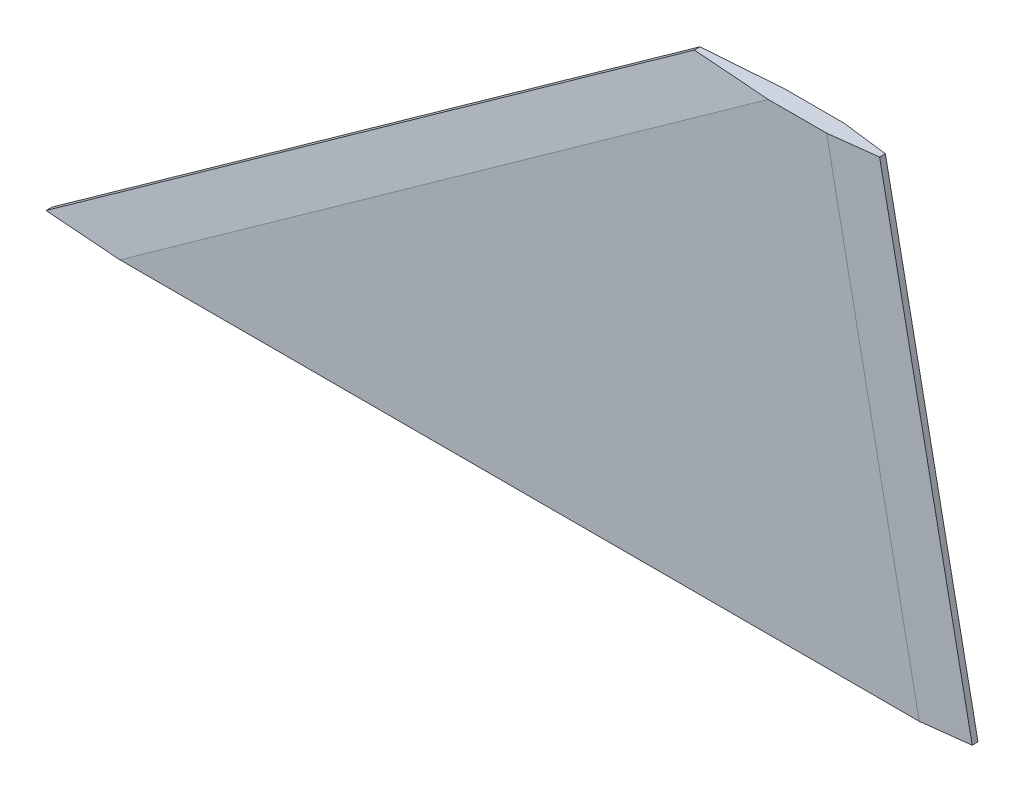
ISO-10303-21;
HEADER;
FILE_DESCRIPTION(('STEP AP214'),'2;1');
FILE_NAME('part.step','',(''),(''),'','','');
FILE_SCHEMA(('AUTOMOTIVE_DESIGN { 1 0 10303 214 1 1 1 1 }'));
ENDSEC;
DATA;
#1=APPLICATION_CONTEXT('core data for automotive mechanical design processes');
#2=APPLICATION_PROTOCOL_DEFINITION('international standard','automotive_design',2000,#1);
#3=PRODUCT_CONTEXT('',#1,'mechanical');
#4=PRODUCT('Part','Part','',(#3));
#5=PRODUCT_RELATED_PRODUCT_CATEGORY('part','',(#4));
#6=PRODUCT_DEFINITION_FORMATION('','',#4);
#7=PRODUCT_DEFINITION_CONTEXT('part definition',#1,'design');
#8=PRODUCT_DEFINITION('design','',#6,#7);
#9=PRODUCT_DEFINITION_SHAPE('','',#8);
#10=(LENGTH_UNIT() NAMED_UNIT(*) SI_UNIT(.MILLI.,.METRE.));
#11=(NAMED_UNIT(*) PLANE_ANGLE_UNIT() SI_UNIT($,.RADIAN.));
#12=(NAMED_UNIT(*) SI_UNIT($,.STERADIAN.) SOLID_ANGLE_UNIT());
#13=UNCERTAINTY_MEASURE_WITH_UNIT(LENGTH_MEASURE(1.E-05),#10,'distance_accuracy_value','');
#14=(GEOMETRIC_REPRESENTATION_CONTEXT(3) GLOBAL_UNCERTAINTY_ASSIGNED_CONTEXT((#13)) GLOBAL_UNIT_ASSIGNED_CONTEXT((#10,
#11,#12)) REPRESENTATION_CONTEXT('',''));
#15=CARTESIAN_POINT('',(0.,0.,0.));
#16=DIRECTION('',(0.,0.,1.));
#17=DIRECTION('',(1.,0.,0.));
#18=AXIS2_PLACEMENT_3D('',#15,#16,#17);
#19=CARTESIAN_POINT('',(177.8,127.,4.7625));
#20=DIRECTION('',(0.581238193719096,-0.813733471206735,0.));
#21=DIRECTION('',(0.813733471206735,0.581238193719096,0.));
#22=AXIS2_PLACEMENT_3D('',#19,#20,#21);
#23=PLANE('',#22);
#24=DIRECTION('',(0.,0.,-1.));
#25=VECTOR('',#24,1.);
#26=CARTESIAN_POINT('',(177.8,127.,4.7625));
#27=LINE('',#26,#25);
#28=CARTESIAN_POINT('',(177.8,127.,3.17499999999999));
#29=VERTEX_POINT('',#28);
#30=CARTESIAN_POINT('',(177.8,127.,1.5875));
#31=VERTEX_POINT('',#30);
#32=EDGE_CURVE('E174',#29,#31,#27,.T.);
#33=ORIENTED_EDGE('',*,*,#32,.T.);
#34=DIRECTION('',(-0.813733471206735,-0.581238193719096,0.));
#35=VECTOR('',#34,1.);
#36=CARTESIAN_POINT('',(0.,0.,1.5875));
#37=LINE('',#36,#35);
#38=CARTESIAN_POINT('',(0.,0.,1.5875));
#39=VERTEX_POINT('',#38);
#40=EDGE_CURVE('E113',#31,#39,#37,.T.);
#41=ORIENTED_EDGE('',*,*,#40,.T.);
#42=DIRECTION('',(0.,0.,-1.));
#43=VECTOR('',#42,1.);
#44=CARTESIAN_POINT('',(0.,0.,4.7625));
#45=LINE('',#44,#43);
#46=CARTESIAN_POINT('',(0.,0.,3.17499999999999));
#47=VERTEX_POINT('',#46);
#48=EDGE_CURVE('E106',#47,#39,#45,.T.);
#49=ORIENTED_EDGE('',*,*,#48,.F.);
#50=DIRECTION('',(0.813733471206735,0.581238193719096,0.));
#51=VECTOR('',#50,1.);
#52=CARTESIAN_POINT('',(177.8,127.,3.17499999999999));
#53=LINE('',#52,#51);
#54=EDGE_CURVE('E118',#47,#29,#53,.T.);
#55=ORIENTED_EDGE('',*,*,#54,.T.);
#56=EDGE_LOOP('',(#33,#41,#49,#55));
#57=FACE_BOUND('',#56,.T.);
#58=ADVANCED_FACE('F36',(#57),#23,.F.);
#59=CARTESIAN_POINT('',(0.,0.,4.7625));
#60=DIRECTION('',(0.,1.,0.));
#61=DIRECTION('',(0.,0.,1.));
#62=AXIS2_PLACEMENT_3D('',#59,#60,#61);
#63=PLANE('',#62);
#64=DIRECTION('',(1.,0.,0.));
#65=VECTOR('',#64,1.);
#66=CARTESIAN_POINT('',(0.,0.,0.));
#67=LINE('',#66,#65);
#68=CARTESIAN_POINT('',(21.8499061782883,0.,0.));
#69=VERTEX_POINT('',#68);
#70=CARTESIAN_POINT('',(241.048490435474,0.,0.));
#71=VERTEX_POINT('',#70);
#72=EDGE_CURVE('E152',#69,#71,#67,.T.);
#73=ORIENTED_EDGE('',*,*,#72,.T.);
#74=DIRECTION('',(0.992571580398274,0.,0.121662063872318));
#75=VECTOR('',#74,1.);
#76=CARTESIAN_POINT('',(254.,0.,1.5875));
#77=LINE('',#76,#75);
#78=CARTESIAN_POINT('',(254.,0.,1.5875));
#79=VERTEX_POINT('',#78);
#80=EDGE_CURVE('E44',#71,#79,#77,.T.);
#81=ORIENTED_EDGE('',*,*,#80,.T.);
#82=DIRECTION('',(0.,0.,-1.));
#83=VECTOR('',#82,1.);
#84=CARTESIAN_POINT('',(254.,0.,4.7625));
#85=LINE('',#84,#83);
#86=CARTESIAN_POINT('',(254.,0.,3.17499999999999));
#87=VERTEX_POINT('',#86);
#88=EDGE_CURVE('E121',#87,#79,#85,.T.);
#89=ORIENTED_EDGE('',*,*,#88,.F.);
#90=DIRECTION('',(0.992571580398275,0.,-0.121662063872315));
#91=VECTOR('',#90,1.);
#92=CARTESIAN_POINT('',(231.914622236616,0.,5.88206183126341));
#93=LINE('',#92,#91);
#94=CARTESIAN_POINT('',(241.048490435474,0.,4.7625));
#95=VERTEX_POINT('',#94);
#96=EDGE_CURVE('E51',#87,#95,#93,.F.);
#97=ORIENTED_EDGE('',*,*,#96,.T.);
#98=DIRECTION('',(1.,0.,0.));
#99=VECTOR('',#98,1.);
#100=CARTESIAN_POINT('',(0.,0.,4.7625));
#101=LINE('',#100,#99);
#102=CARTESIAN_POINT('',(21.8499061782891,0.,4.7625));
#103=VERTEX_POINT('',#102);
#104=EDGE_CURVE('E107',#103,#95,#101,.T.);
#105=ORIENTED_EDGE('',*,*,#104,.F.);
#106=DIRECTION('',(0.997371045454218,0.,0.0724637681159401));
#107=VECTOR('',#106,1.);
#108=CARTESIAN_POINT('',(7.45769744585585,0.,3.71683732409157));
#109=LINE('',#108,#107);
#110=EDGE_CURVE('E103',#103,#47,#109,.F.);
#111=ORIENTED_EDGE('',*,*,#110,.T.);
#112=ORIENTED_EDGE('',*,*,#48,.T.);
#113=DIRECTION('',(0.997371045454218,0.,-0.0724637681159421));
#114=VECTOR('',#113,1.);
#115=CARTESIAN_POINT('',(176.866372610796,0.,-11.2626863682435));
#116=LINE('',#115,#114);
#117=EDGE_CURVE('E112',#39,#69,#116,.T.);
#118=ORIENTED_EDGE('',*,*,#117,.T.);
#119=EDGE_LOOP('',(#73,#81,#89,#97,#105,#111,#112,#118));
#120=FACE_BOUND('',#119,.T.);
#121=ADVANCED_FACE('F105',(#120),#63,.F.);
#122=CARTESIAN_POINT('',(254.,0.,4.7625));
#123=DIRECTION('',(-0.98058067569092,-0.196116135138184,0.));
#124=DIRECTION('',(0.196116135138184,-0.98058067569092,0.));
#125=AXIS2_PLACEMENT_3D('',#122,#123,#124);
#126=PLANE('',#125);
#127=ORIENTED_EDGE('',*,*,#88,.T.);
#128=DIRECTION('',(-0.196116135138184,0.98058067569092,0.));
#129=VECTOR('',#128,1.);
#130=CARTESIAN_POINT('',(228.6,127.,1.5875));
#131=LINE('',#130,#129);
#132=CARTESIAN_POINT('',(228.6,127.,1.5875));
#133=VERTEX_POINT('',#132);
#134=EDGE_CURVE('E142',#79,#133,#131,.T.);
#135=ORIENTED_EDGE('',*,*,#134,.T.);
#136=DIRECTION('',(0.,0.,-1.));
#137=VECTOR('',#136,1.);
#138=CARTESIAN_POINT('',(228.6,127.,4.7625));
#139=LINE('',#138,#137);
#140=CARTESIAN_POINT('',(228.6,127.,3.17499999999999));
#141=VERTEX_POINT('',#140);
#142=EDGE_CURVE('E160',#141,#133,#139,.T.);
#143=ORIENTED_EDGE('',*,*,#142,.F.);
#144=DIRECTION('',(0.196116135138184,-0.98058067569092,0.));
#145=VECTOR('',#144,1.);
#146=CARTESIAN_POINT('',(254.,0.,3.17499999999999));
#147=LINE('',#146,#145);
#148=EDGE_CURVE('E140',#141,#87,#147,.T.);
#149=ORIENTED_EDGE('',*,*,#148,.T.);
#150=EDGE_LOOP('',(#127,#135,#143,#149));
#151=FACE_BOUND('',#150,.T.);
#152=ADVANCED_FACE('F156',(#151),#126,.F.);
#153=CARTESIAN_POINT('',(228.6,127.,4.7625));
#154=DIRECTION('',(0.,-1.,0.));
#155=DIRECTION('',(1.,0.,0.));
#156=AXIS2_PLACEMENT_3D('',#153,#154,#155);
#157=PLANE('',#156);
#158=ORIENTED_EDGE('',*,*,#142,.T.);
#159=DIRECTION('',(-0.992571580398274,0.,-0.121662063872318));
#160=VECTOR('',#159,1.);
#161=CARTESIAN_POINT('',(253.624037892244,127.,4.65476099811148));
#162=LINE('',#161,#160);
#163=CARTESIAN_POINT('',(215.648490435474,127.,0.));
#164=VERTEX_POINT('',#163);
#165=EDGE_CURVE('E147',#133,#164,#162,.T.);
#166=ORIENTED_EDGE('',*,*,#165,.T.);
#167=DIRECTION('',(-1.,0.,0.));
#168=VECTOR('',#167,1.);
#169=CARTESIAN_POINT('',(228.6,127.,0.));
#170=LINE('',#169,#168);
#171=CARTESIAN_POINT('',(199.649906178288,127.,0.));
#172=VERTEX_POINT('',#171);
#173=EDGE_CURVE('E164',#164,#172,#170,.T.);
#174=ORIENTED_EDGE('',*,*,#173,.T.);
#175=DIRECTION('',(-0.997371045454218,0.,0.0724637681159422));
#176=VECTOR('',#175,1.);
#177=CARTESIAN_POINT('',(177.8,127.,1.5875));
#178=LINE('',#177,#176);
#179=EDGE_CURVE('E136',#172,#31,#178,.T.);
#180=ORIENTED_EDGE('',*,*,#179,.T.);
#181=ORIENTED_EDGE('',*,*,#32,.F.);
#182=DIRECTION('',(-0.997371045454218,0.,-0.0724637681159401));
#183=VECTOR('',#182,1.);
#184=CARTESIAN_POINT('',(8.39132483505983,127.,-9.13334904415155));
#185=LINE('',#184,#183);
#186=CARTESIAN_POINT('',(199.649906178289,127.,4.7625));
#187=VERTEX_POINT('',#186);
#188=EDGE_CURVE('E126',#29,#187,#185,.F.);
#189=ORIENTED_EDGE('',*,*,#188,.T.);
#190=DIRECTION('',(-1.,0.,0.));
#191=VECTOR('',#190,1.);
#192=CARTESIAN_POINT('',(228.6,127.,4.7625));
#193=LINE('',#192,#191);
#194=CARTESIAN_POINT('',(215.648490435474,127.,4.7625));
#195=VERTEX_POINT('',#194);
#196=EDGE_CURVE('E169',#195,#187,#193,.T.);
#197=ORIENTED_EDGE('',*,*,#196,.F.);
#198=DIRECTION('',(-0.992571580398275,0.,0.121662063872315));
#199=VECTOR('',#198,1.);
#200=CARTESIAN_POINT('',(231.53866012886,127.,2.81480083315202));
#201=LINE('',#200,#199);
#202=EDGE_CURVE('E145',#195,#141,#201,.F.);
#203=ORIENTED_EDGE('',*,*,#202,.T.);
#204=EDGE_LOOP('',(#158,#166,#174,#180,#181,#189,#197,#203));
#205=FACE_BOUND('',#204,.T.);
#206=ADVANCED_FACE('F163',(#205),#157,.F.);
#207=CARTESIAN_POINT('',(0.,0.,4.7625));
#208=DIRECTION('',(0.,0.,-1.));
#209=DIRECTION('',(-1.,0.,0.));
#210=AXIS2_PLACEMENT_3D('',#207,#208,#209);
#211=PLANE('',#210);
#212=ORIENTED_EDGE('',*,*,#104,.T.);
#213=DIRECTION('',(-0.196116135138184,0.98058067569092,0.));
#214=VECTOR('',#213,1.);
#215=CARTESIAN_POINT('',(231.777394649494,46.3554789298989,4.7625));
#216=LINE('',#215,#214);
#217=EDGE_CURVE('E11',#95,#195,#216,.T.);
#218=ORIENTED_EDGE('',*,*,#217,.T.);
#219=ORIENTED_EDGE('',*,*,#196,.T.);
#220=DIRECTION('',(-0.813733471206735,-0.581238193719097,0.));
#221=VECTOR('',#220,1.);
#222=CARTESIAN_POINT('',(7.38172506023279,-10.3344150843259,4.7625));
#223=LINE('',#222,#221);
#224=EDGE_CURVE('E138',#187,#103,#223,.T.);
#225=ORIENTED_EDGE('',*,*,#224,.T.);
#226=EDGE_LOOP('',(#212,#218,#219,#225));
#227=FACE_BOUND('',#226,.T.);
#228=ADVANCED_FACE('F178',(#227),#211,.F.);
#229=CARTESIAN_POINT('',(0.,0.,0.));
#230=DIRECTION('',(0.,0.,-1.));
#231=DIRECTION('',(-1.,0.,0.));
#232=AXIS2_PLACEMENT_3D('',#229,#230,#231);
#233=PLANE('',#232);
#234=ORIENTED_EDGE('',*,*,#173,.F.);
#235=DIRECTION('',(0.196116135138184,-0.98058067569092,0.));
#236=VECTOR('',#235,1.);
#237=CARTESIAN_POINT('',(241.546625418725,-2.49067491625494,0.));
#238=LINE('',#237,#236);
#239=EDGE_CURVE('E59',#164,#71,#238,.T.);
#240=ORIENTED_EDGE('',*,*,#239,.T.);
#241=ORIENTED_EDGE('',*,*,#72,.F.);
#242=DIRECTION('',(0.813733471206735,0.581238193719097,0.));
#243=VECTOR('',#242,1.);
#244=CARTESIAN_POINT('',(185.181725060232,116.665584915674,0.));
#245=LINE('',#244,#243);
#246=EDGE_CURVE('E132',#69,#172,#245,.T.);
#247=ORIENTED_EDGE('',*,*,#246,.T.);
#248=EDGE_LOOP('',(#234,#240,#241,#247));
#249=FACE_BOUND('',#248,.T.);
#250=ADVANCED_FACE('F165',(#249),#233,.T.);
#251=CARTESIAN_POINT('',(177.8,127.,1.5875));
#252=DIRECTION('',(-0.0720937250910591,0.100931215127483,-0.992277876713668));
#253=DIRECTION('',(0.813733471206735,0.581238193719096,0.));
#254=AXIS2_PLACEMENT_3D('',#251,#252,#253);
#255=PLANE('',#254);
#256=ORIENTED_EDGE('',*,*,#179,.F.);
#257=ORIENTED_EDGE('',*,*,#246,.F.);
#258=ORIENTED_EDGE('',*,*,#117,.F.);
#259=ORIENTED_EDGE('',*,*,#40,.F.);
#260=EDGE_LOOP('',(#256,#257,#258,#259));
#261=FACE_BOUND('',#260,.T.);
#262=ADVANCED_FACE('F181',(#261),#255,.T.);
#263=CARTESIAN_POINT('',(7.38172506023279,-10.3344150843259,4.7625));
#264=DIRECTION('',(0.0720937250910571,-0.10093121512748,-0.992277876713668));
#265=DIRECTION('',(-0.813733471206735,-0.581238193719096,0.));
#266=AXIS2_PLACEMENT_3D('',#263,#264,#265);
#267=PLANE('',#266);
#268=ORIENTED_EDGE('',*,*,#188,.F.);
#269=ORIENTED_EDGE('',*,*,#54,.F.);
#270=ORIENTED_EDGE('',*,*,#110,.F.);
#271=ORIENTED_EDGE('',*,*,#224,.F.);
#272=EDGE_LOOP('',(#268,#269,#270,#271));
#273=FACE_BOUND('',#272,.T.);
#274=ADVANCED_FACE('F124',(#273),#267,.F.);
#275=CARTESIAN_POINT('',(254.,0.,1.5875));
#276=DIRECTION('',(0.12162606385263,0.024325212770526,-0.992277876713668));
#277=DIRECTION('',(0.196116135138184,-0.98058067569092,0.));
#278=AXIS2_PLACEMENT_3D('',#275,#276,#277);
#279=PLANE('',#278);
#280=ORIENTED_EDGE('',*,*,#80,.F.);
#281=ORIENTED_EDGE('',*,*,#239,.F.);
#282=ORIENTED_EDGE('',*,*,#165,.F.);
#283=ORIENTED_EDGE('',*,*,#134,.F.);
#284=EDGE_LOOP('',(#280,#281,#282,#283));
#285=FACE_BOUND('',#284,.T.);
#286=ADVANCED_FACE('F161',(#285),#279,.T.);
#287=CARTESIAN_POINT('',(231.777394649494,46.3554789298989,4.7625));
#288=DIRECTION('',(-0.121626063852627,-0.0243252127705254,-0.992277876713668));
#289=DIRECTION('',(-0.196116135138184,0.98058067569092,0.));
#290=AXIS2_PLACEMENT_3D('',#287,#288,#289);
#291=PLANE('',#290);
#292=ORIENTED_EDGE('',*,*,#96,.F.);
#293=ORIENTED_EDGE('',*,*,#148,.F.);
#294=ORIENTED_EDGE('',*,*,#202,.F.);
#295=ORIENTED_EDGE('',*,*,#217,.F.);
#296=EDGE_LOOP('',(#292,#293,#294,#295));
#297=FACE_BOUND('',#296,.T.);
#298=ADVANCED_FACE('F38',(#297),#291,.F.);
#299=CLOSED_SHELL('',(#58,#121,#152,#206,#228,#250,#262,#274,#286,#298));
#300=MANIFOLD_SOLID_BREP('B2',#299);
#301=ADVANCED_BREP_SHAPE_REPRESENTATION('',(#18,#300),#14);
#302=SHAPE_DEFINITION_REPRESENTATION(#9,#301);
ENDSEC;
END-ISO-10303-21;
